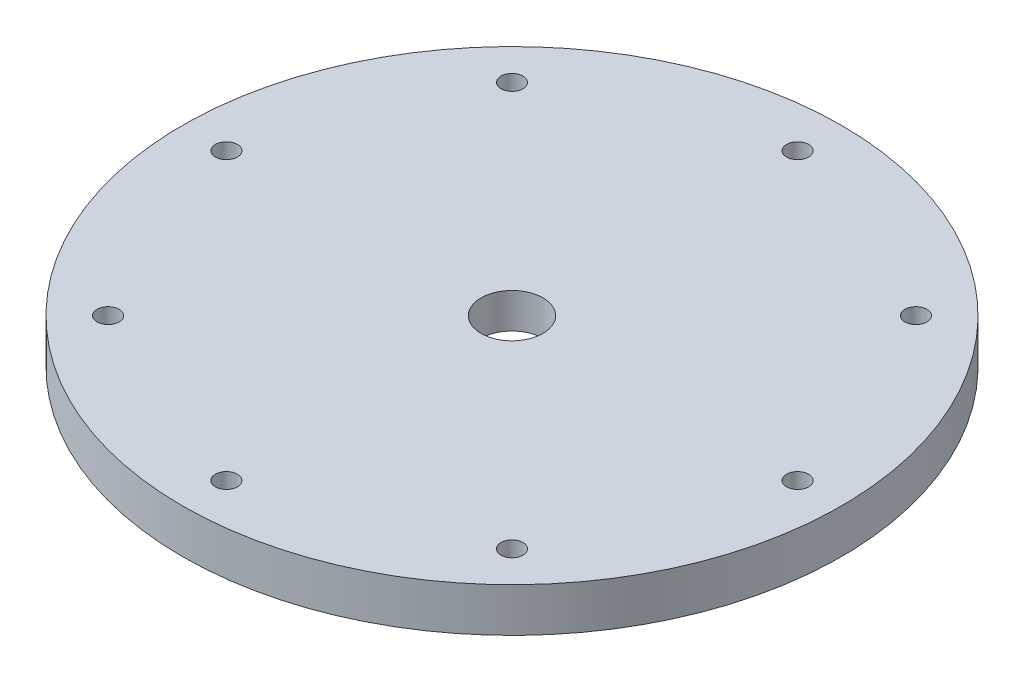
ISO-10303-21;
HEADER;
FILE_DESCRIPTION(('STEP AP214'),'2;1');
FILE_NAME('part.step','',(''),(''),'','','');
FILE_SCHEMA(('AUTOMOTIVE_DESIGN { 1 0 10303 214 1 1 1 1 }'));
ENDSEC;
DATA;
#1=APPLICATION_CONTEXT('core data for automotive mechanical design processes');
#2=APPLICATION_PROTOCOL_DEFINITION('international standard','automotive_design',2000,#1);
#3=PRODUCT_CONTEXT('',#1,'mechanical');
#4=PRODUCT('Part','Part','',(#3));
#5=PRODUCT_RELATED_PRODUCT_CATEGORY('part','',(#4));
#6=PRODUCT_DEFINITION_FORMATION('','',#4);
#7=PRODUCT_DEFINITION_CONTEXT('part definition',#1,'design');
#8=PRODUCT_DEFINITION('design','',#6,#7);
#9=PRODUCT_DEFINITION_SHAPE('','',#8);
#10=(LENGTH_UNIT() NAMED_UNIT(*) SI_UNIT(.MILLI.,.METRE.));
#11=(NAMED_UNIT(*) PLANE_ANGLE_UNIT() SI_UNIT($,.RADIAN.));
#12=(NAMED_UNIT(*) SI_UNIT($,.STERADIAN.) SOLID_ANGLE_UNIT());
#13=UNCERTAINTY_MEASURE_WITH_UNIT(LENGTH_MEASURE(1.E-05),#10,'distance_accuracy_value','');
#14=(GEOMETRIC_REPRESENTATION_CONTEXT(3) GLOBAL_UNCERTAINTY_ASSIGNED_CONTEXT((#13)) GLOBAL_UNIT_ASSIGNED_CONTEXT((#10,
#11,#12)) REPRESENTATION_CONTEXT('',''));
#15=CARTESIAN_POINT('',(0.,0.,0.));
#16=DIRECTION('',(0.,0.,1.));
#17=DIRECTION('',(1.,0.,0.));
#18=AXIS2_PLACEMENT_3D('',#15,#16,#17);
#19=CARTESIAN_POINT('',(0.,12.7,0.));
#20=DIRECTION('',(0.,-1.,0.));
#21=DIRECTION('',(0.,0.,-1.));
#22=AXIS2_PLACEMENT_3D('',#19,#20,#21);
#23=CYLINDRICAL_SURFACE('',#22,95.25);
#24=CARTESIAN_POINT('',(0.,12.7,0.));
#25=DIRECTION('',(0.,1.,0.));
#26=DIRECTION('',(0.,0.,1.));
#27=AXIS2_PLACEMENT_3D('',#24,#25,#26);
#28=CIRCLE('',#27,95.25);
#29=CARTESIAN_POINT('',(0.,12.7,95.25));
#30=VERTEX_POINT('',#29);
#31=EDGE_CURVE('E10',#30,#30,#28,.T.);
#32=ORIENTED_EDGE('',*,*,#31,.F.);
#33=EDGE_LOOP('',(#32));
#34=FACE_BOUND('',#33,.T.);
#35=CARTESIAN_POINT('',(0.,0.,0.));
#36=DIRECTION('',(0.,1.,0.));
#37=DIRECTION('',(0.,0.,1.));
#38=AXIS2_PLACEMENT_3D('',#35,#36,#37);
#39=CIRCLE('',#38,95.25);
#40=CARTESIAN_POINT('',(0.,0.,95.25));
#41=VERTEX_POINT('',#40);
#42=EDGE_CURVE('E42',#41,#41,#39,.T.);
#43=ORIENTED_EDGE('',*,*,#42,.T.);
#44=EDGE_LOOP('',(#43));
#45=FACE_BOUND('',#44,.T.);
#46=ADVANCED_FACE('F39',(#34,#45),#23,.T.);
#47=CARTESIAN_POINT('',(0.,12.7,0.));
#48=DIRECTION('',(0.,1.,0.));
#49=DIRECTION('',(0.,0.,1.));
#50=AXIS2_PLACEMENT_3D('',#47,#48,#49);
#51=PLANE('',#50);
#52=CARTESIAN_POINT('',(0.,12.7,0.));
#53=DIRECTION('',(0.,-1.,0.));
#54=DIRECTION('',(0.,0.,-1.));
#55=AXIS2_PLACEMENT_3D('',#52,#53,#54);
#56=CIRCLE('',#55,8.929751);
#57=CARTESIAN_POINT('',(0.,12.7,-8.929751));
#58=VERTEX_POINT('',#57);
#59=EDGE_CURVE('E137',#58,#58,#56,.T.);
#60=ORIENTED_EDGE('',*,*,#59,.T.);
#61=EDGE_LOOP('',(#60));
#62=FACE_BOUND('',#61,.T.);
#63=CARTESIAN_POINT('',(58.3716647869488,12.7,58.3716647869502));
#64=DIRECTION('',(0.,-1.,0.));
#65=DIRECTION('',(0.,0.,-1.));
#66=AXIS2_PLACEMENT_3D('',#63,#64,#65);
#67=CIRCLE('',#66,3.175);
#68=CARTESIAN_POINT('',(58.3716647869488,12.7,55.1966647869502));
#69=VERTEX_POINT('',#68);
#70=EDGE_CURVE('E108',#69,#69,#67,.T.);
#71=ORIENTED_EDGE('',*,*,#70,.T.);
#72=EDGE_LOOP('',(#71));
#73=FACE_BOUND('',#72,.T.);
#74=CARTESIAN_POINT('',(82.55,12.7,8.64665353564502E-13));
#75=DIRECTION('',(0.,-1.,0.));
#76=DIRECTION('',(0.,0.,-1.));
#77=AXIS2_PLACEMENT_3D('',#74,#75,#76);
#78=CIRCLE('',#77,3.175);
#79=CARTESIAN_POINT('',(82.55,12.7,-3.17499999999913));
#80=VERTEX_POINT('',#79);
#81=EDGE_CURVE('E100',#80,#80,#78,.T.);
#82=ORIENTED_EDGE('',*,*,#81,.T.);
#83=EDGE_LOOP('',(#82));
#84=FACE_BOUND('',#83,.T.);
#85=CARTESIAN_POINT('',(58.37166478695,12.7,-58.371664786949));
#86=DIRECTION('',(0.,-1.,0.));
#87=DIRECTION('',(0.,0.,-1.));
#88=AXIS2_PLACEMENT_3D('',#85,#86,#87);
#89=CIRCLE('',#88,3.175);
#90=CARTESIAN_POINT('',(58.37166478695,12.7,-61.546664786949));
#91=VERTEX_POINT('',#90);
#92=EDGE_CURVE('E92',#91,#91,#89,.T.);
#93=ORIENTED_EDGE('',*,*,#92,.T.);
#94=EDGE_LOOP('',(#93));
#95=FACE_BOUND('',#94,.T.);
#96=CARTESIAN_POINT('',(0.,12.7,-82.55));
#97=DIRECTION('',(0.,-1.,0.));
#98=DIRECTION('',(0.,0.,-1.));
#99=AXIS2_PLACEMENT_3D('',#96,#97,#98);
#100=CIRCLE('',#99,3.175);
#101=CARTESIAN_POINT('',(0.,12.7,-85.725));
#102=VERTEX_POINT('',#101);
#103=EDGE_CURVE('E84',#102,#102,#100,.T.);
#104=ORIENTED_EDGE('',*,*,#103,.T.);
#105=EDGE_LOOP('',(#104));
#106=FACE_BOUND('',#105,.T.);
#107=CARTESIAN_POINT('',(-58.3716647869492,12.7,-58.3716647869498));
#108=DIRECTION('',(0.,-1.,0.));
#109=DIRECTION('',(0.,0.,-1.));
#110=AXIS2_PLACEMENT_3D('',#107,#108,#109);
#111=CIRCLE('',#110,3.175);
#112=CARTESIAN_POINT('',(-58.3716647869492,12.7,-61.5466647869498));
#113=VERTEX_POINT('',#112);
#114=EDGE_CURVE('E76',#113,#113,#111,.T.);
#115=ORIENTED_EDGE('',*,*,#114,.T.);
#116=EDGE_LOOP('',(#115));
#117=FACE_BOUND('',#116,.T.);
#118=CARTESIAN_POINT('',(-82.55,12.7,-2.88221784521501E-13));
#119=DIRECTION('',(0.,-1.,0.));
#120=DIRECTION('',(0.,0.,-1.));
#121=AXIS2_PLACEMENT_3D('',#118,#119,#120);
#122=CIRCLE('',#121,3.175);
#123=CARTESIAN_POINT('',(-82.55,12.7,-3.17500000000029));
#124=VERTEX_POINT('',#123);
#125=EDGE_CURVE('E68',#124,#124,#122,.T.);
#126=ORIENTED_EDGE('',*,*,#125,.T.);
#127=EDGE_LOOP('',(#126));
#128=FACE_BOUND('',#127,.T.);
#129=CARTESIAN_POINT('',(-58.3716647869496,12.7,58.3716647869494));
#130=DIRECTION('',(0.,-1.,0.));
#131=DIRECTION('',(0.,0.,-1.));
#132=AXIS2_PLACEMENT_3D('',#129,#130,#131);
#133=CIRCLE('',#132,3.175);
#134=CARTESIAN_POINT('',(-58.3716647869496,12.7,55.1966647869494));
#135=VERTEX_POINT('',#134);
#136=EDGE_CURVE('E60',#135,#135,#133,.T.);
#137=ORIENTED_EDGE('',*,*,#136,.T.);
#138=EDGE_LOOP('',(#137));
#139=FACE_BOUND('',#138,.T.);
#140=CARTESIAN_POINT('',(0.,12.7,82.55));
#141=DIRECTION('',(0.,-1.,0.));
#142=DIRECTION('',(0.,0.,-1.));
#143=AXIS2_PLACEMENT_3D('',#140,#141,#142);
#144=CIRCLE('',#143,3.175);
#145=CARTESIAN_POINT('',(0.,12.7,79.375));
#146=VERTEX_POINT('',#145);
#147=EDGE_CURVE('E51',#146,#146,#144,.T.);
#148=ORIENTED_EDGE('',*,*,#147,.T.);
#149=EDGE_LOOP('',(#148));
#150=FACE_BOUND('',#149,.T.);
#151=ORIENTED_EDGE('',*,*,#31,.T.);
#152=EDGE_LOOP('',(#151));
#153=FACE_BOUND('',#152,.T.);
#154=ADVANCED_FACE('F171',(#62,#73,#84,#95,#106,#117,#128,#139,#150,#153),#51,.T.);
#155=CARTESIAN_POINT('',(0.,0.,0.));
#156=DIRECTION('',(0.,1.,0.));
#157=DIRECTION('',(0.,0.,1.));
#158=AXIS2_PLACEMENT_3D('',#155,#156,#157);
#159=PLANE('',#158);
#160=CARTESIAN_POINT('',(0.,0.,0.));
#161=DIRECTION('',(0.,-1.,0.));
#162=DIRECTION('',(0.,0.,-1.));
#163=AXIS2_PLACEMENT_3D('',#160,#161,#162);
#164=CIRCLE('',#163,69.9135);
#165=CARTESIAN_POINT('',(0.,0.,-69.9135));
#166=VERTEX_POINT('',#165);
#167=EDGE_CURVE('E117',#166,#166,#164,.T.);
#168=ORIENTED_EDGE('',*,*,#167,.F.);
#169=EDGE_LOOP('',(#168));
#170=FACE_BOUND('',#169,.T.);
#171=CARTESIAN_POINT('',(58.3716647869488,0.,58.3716647869502));
#172=DIRECTION('',(0.,-1.,0.));
#173=DIRECTION('',(0.,0.,-1.));
#174=AXIS2_PLACEMENT_3D('',#171,#172,#173);
#175=CIRCLE('',#174,3.17499999999998);
#176=CARTESIAN_POINT('',(58.3716647869488,0.,55.1966647869502));
#177=VERTEX_POINT('',#176);
#178=EDGE_CURVE('E112',#177,#177,#175,.T.);
#179=ORIENTED_EDGE('',*,*,#178,.F.);
#180=EDGE_LOOP('',(#179));
#181=FACE_BOUND('',#180,.T.);
#182=CARTESIAN_POINT('',(82.55,0.,8.64665353564502E-13));
#183=DIRECTION('',(0.,-1.,0.));
#184=DIRECTION('',(0.,0.,-1.));
#185=AXIS2_PLACEMENT_3D('',#182,#183,#184);
#186=CIRCLE('',#185,3.17499999999998);
#187=CARTESIAN_POINT('',(82.55,0.,-3.17499999999912));
#188=VERTEX_POINT('',#187);
#189=EDGE_CURVE('E104',#188,#188,#186,.T.);
#190=ORIENTED_EDGE('',*,*,#189,.F.);
#191=EDGE_LOOP('',(#190));
#192=FACE_BOUND('',#191,.T.);
#193=CARTESIAN_POINT('',(58.37166478695,0.,-58.371664786949));
#194=DIRECTION('',(0.,-1.,0.));
#195=DIRECTION('',(0.,0.,-1.));
#196=AXIS2_PLACEMENT_3D('',#193,#194,#195);
#197=CIRCLE('',#196,3.17499999999999);
#198=CARTESIAN_POINT('',(58.37166478695,0.,-61.546664786949));
#199=VERTEX_POINT('',#198);
#200=EDGE_CURVE('E96',#199,#199,#197,.T.);
#201=ORIENTED_EDGE('',*,*,#200,.F.);
#202=EDGE_LOOP('',(#201));
#203=FACE_BOUND('',#202,.T.);
#204=CARTESIAN_POINT('',(0.,0.,-82.55));
#205=DIRECTION('',(0.,-1.,0.));
#206=DIRECTION('',(0.,0.,-1.));
#207=AXIS2_PLACEMENT_3D('',#204,#205,#206);
#208=CIRCLE('',#207,3.17499999999999);
#209=CARTESIAN_POINT('',(0.,0.,-85.725));
#210=VERTEX_POINT('',#209);
#211=EDGE_CURVE('E88',#210,#210,#208,.T.);
#212=ORIENTED_EDGE('',*,*,#211,.F.);
#213=EDGE_LOOP('',(#212));
#214=FACE_BOUND('',#213,.T.);
#215=CARTESIAN_POINT('',(-58.3716647869492,0.,-58.3716647869498));
#216=DIRECTION('',(0.,-1.,0.));
#217=DIRECTION('',(0.,0.,-1.));
#218=AXIS2_PLACEMENT_3D('',#215,#216,#217);
#219=CIRCLE('',#218,3.17499999999998);
#220=CARTESIAN_POINT('',(-58.3716647869492,0.,-61.5466647869498));
#221=VERTEX_POINT('',#220);
#222=EDGE_CURVE('E80',#221,#221,#219,.T.);
#223=ORIENTED_EDGE('',*,*,#222,.F.);
#224=EDGE_LOOP('',(#223));
#225=FACE_BOUND('',#224,.T.);
#226=CARTESIAN_POINT('',(-82.55,0.,-2.88221784521501E-13));
#227=DIRECTION('',(0.,-1.,0.));
#228=DIRECTION('',(0.,0.,-1.));
#229=AXIS2_PLACEMENT_3D('',#226,#227,#228);
#230=CIRCLE('',#229,3.17499999999998);
#231=CARTESIAN_POINT('',(-82.55,0.,-3.17500000000027));
#232=VERTEX_POINT('',#231);
#233=EDGE_CURVE('E72',#232,#232,#230,.T.);
#234=ORIENTED_EDGE('',*,*,#233,.F.);
#235=EDGE_LOOP('',(#234));
#236=FACE_BOUND('',#235,.T.);
#237=CARTESIAN_POINT('',(-58.3716647869496,0.,58.3716647869494));
#238=DIRECTION('',(0.,-1.,0.));
#239=DIRECTION('',(0.,0.,-1.));
#240=AXIS2_PLACEMENT_3D('',#237,#238,#239);
#241=CIRCLE('',#240,3.17499999999999);
#242=CARTESIAN_POINT('',(-58.3716647869496,0.,55.1966647869494));
#243=VERTEX_POINT('',#242);
#244=EDGE_CURVE('E64',#243,#243,#241,.T.);
#245=ORIENTED_EDGE('',*,*,#244,.F.);
#246=EDGE_LOOP('',(#245));
#247=FACE_BOUND('',#246,.T.);
#248=CARTESIAN_POINT('',(0.,0.,82.55));
#249=DIRECTION('',(0.,-1.,0.));
#250=DIRECTION('',(0.,0.,-1.));
#251=AXIS2_PLACEMENT_3D('',#248,#249,#250);
#252=CIRCLE('',#251,3.17499999999999);
#253=CARTESIAN_POINT('',(0.,0.,79.375));
#254=VERTEX_POINT('',#253);
#255=EDGE_CURVE('E56',#254,#254,#252,.T.);
#256=ORIENTED_EDGE('',*,*,#255,.F.);
#257=EDGE_LOOP('',(#256));
#258=FACE_BOUND('',#257,.T.);
#259=ORIENTED_EDGE('',*,*,#42,.F.);
#260=EDGE_LOOP('',(#259));
#261=FACE_BOUND('',#260,.T.);
#262=ADVANCED_FACE('F176',(#170,#181,#192,#203,#214,#225,#236,#247,#258,#261),#159,.F.);
#263=CARTESIAN_POINT('',(0.,0.,82.55));
#264=DIRECTION('',(0.,-1.,0.));
#265=DIRECTION('',(0.,0.,-1.));
#266=AXIS2_PLACEMENT_3D('',#263,#264,#265);
#267=CYLINDRICAL_SURFACE('',#266,3.17499999999999);
#268=ORIENTED_EDGE('',*,*,#147,.F.);
#269=EDGE_LOOP('',(#268));
#270=FACE_BOUND('',#269,.T.);
#271=ORIENTED_EDGE('',*,*,#255,.T.);
#272=EDGE_LOOP('',(#271));
#273=FACE_BOUND('',#272,.T.);
#274=ADVANCED_FACE('F183',(#270,#273),#267,.F.);
#275=CARTESIAN_POINT('',(-58.3716647869496,0.,58.3716647869494));
#276=DIRECTION('',(0.,-1.,0.));
#277=DIRECTION('',(0.,0.,-1.));
#278=AXIS2_PLACEMENT_3D('',#275,#276,#277);
#279=CYLINDRICAL_SURFACE('',#278,3.17499999999999);
#280=ORIENTED_EDGE('',*,*,#136,.F.);
#281=EDGE_LOOP('',(#280));
#282=FACE_BOUND('',#281,.T.);
#283=ORIENTED_EDGE('',*,*,#244,.T.);
#284=EDGE_LOOP('',(#283));
#285=FACE_BOUND('',#284,.T.);
#286=ADVANCED_FACE('F188',(#282,#285),#279,.F.);
#287=CARTESIAN_POINT('',(-82.55,0.,-2.88221784521501E-13));
#288=DIRECTION('',(0.,-1.,0.));
#289=DIRECTION('',(0.,0.,-1.));
#290=AXIS2_PLACEMENT_3D('',#287,#288,#289);
#291=CYLINDRICAL_SURFACE('',#290,3.17499999999999);
#292=ORIENTED_EDGE('',*,*,#125,.F.);
#293=EDGE_LOOP('',(#292));
#294=FACE_BOUND('',#293,.T.);
#295=ORIENTED_EDGE('',*,*,#233,.T.);
#296=EDGE_LOOP('',(#295));
#297=FACE_BOUND('',#296,.T.);
#298=ADVANCED_FACE('F196',(#294,#297),#291,.F.);
#299=CARTESIAN_POINT('',(-58.3716647869492,0.,-58.3716647869498));
#300=DIRECTION('',(0.,-1.,0.));
#301=DIRECTION('',(0.,0.,-1.));
#302=AXIS2_PLACEMENT_3D('',#299,#300,#301);
#303=CYLINDRICAL_SURFACE('',#302,3.17499999999999);
#304=ORIENTED_EDGE('',*,*,#114,.F.);
#305=EDGE_LOOP('',(#304));
#306=FACE_BOUND('',#305,.T.);
#307=ORIENTED_EDGE('',*,*,#222,.T.);
#308=EDGE_LOOP('',(#307));
#309=FACE_BOUND('',#308,.T.);
#310=ADVANCED_FACE('F200',(#306,#309),#303,.F.);
#311=CARTESIAN_POINT('',(0.,0.,-82.55));
#312=DIRECTION('',(0.,-1.,0.));
#313=DIRECTION('',(0.,0.,-1.));
#314=AXIS2_PLACEMENT_3D('',#311,#312,#313);
#315=CYLINDRICAL_SURFACE('',#314,3.17499999999999);
#316=ORIENTED_EDGE('',*,*,#103,.F.);
#317=EDGE_LOOP('',(#316));
#318=FACE_BOUND('',#317,.T.);
#319=ORIENTED_EDGE('',*,*,#211,.T.);
#320=EDGE_LOOP('',(#319));
#321=FACE_BOUND('',#320,.T.);
#322=ADVANCED_FACE('F204',(#318,#321),#315,.F.);
#323=CARTESIAN_POINT('',(58.37166478695,0.,-58.371664786949));
#324=DIRECTION('',(0.,-1.,0.));
#325=DIRECTION('',(0.,0.,-1.));
#326=AXIS2_PLACEMENT_3D('',#323,#324,#325);
#327=CYLINDRICAL_SURFACE('',#326,3.17499999999999);
#328=ORIENTED_EDGE('',*,*,#92,.F.);
#329=EDGE_LOOP('',(#328));
#330=FACE_BOUND('',#329,.T.);
#331=ORIENTED_EDGE('',*,*,#200,.T.);
#332=EDGE_LOOP('',(#331));
#333=FACE_BOUND('',#332,.T.);
#334=ADVANCED_FACE('F208',(#330,#333),#327,.F.);
#335=CARTESIAN_POINT('',(82.55,0.,8.64665353564502E-13));
#336=DIRECTION('',(0.,-1.,0.));
#337=DIRECTION('',(0.,0.,-1.));
#338=AXIS2_PLACEMENT_3D('',#335,#336,#337);
#339=CYLINDRICAL_SURFACE('',#338,3.17499999999999);
#340=ORIENTED_EDGE('',*,*,#81,.F.);
#341=EDGE_LOOP('',(#340));
#342=FACE_BOUND('',#341,.T.);
#343=ORIENTED_EDGE('',*,*,#189,.T.);
#344=EDGE_LOOP('',(#343));
#345=FACE_BOUND('',#344,.T.);
#346=ADVANCED_FACE('F212',(#342,#345),#339,.F.);
#347=CARTESIAN_POINT('',(58.3716647869488,0.,58.3716647869502));
#348=DIRECTION('',(0.,-1.,0.));
#349=DIRECTION('',(0.,0.,-1.));
#350=AXIS2_PLACEMENT_3D('',#347,#348,#349);
#351=CYLINDRICAL_SURFACE('',#350,3.17499999999999);
#352=ORIENTED_EDGE('',*,*,#70,.F.);
#353=EDGE_LOOP('',(#352));
#354=FACE_BOUND('',#353,.T.);
#355=ORIENTED_EDGE('',*,*,#178,.T.);
#356=EDGE_LOOP('',(#355));
#357=FACE_BOUND('',#356,.T.);
#358=ADVANCED_FACE('F216',(#354,#357),#351,.F.);
#359=CARTESIAN_POINT('',(0.,2.54,0.));
#360=DIRECTION('',(0.,-1.,0.));
#361=DIRECTION('',(0.,0.,-1.));
#362=AXIS2_PLACEMENT_3D('',#359,#360,#361);
#363=CYLINDRICAL_SURFACE('',#362,69.9135);
#364=CARTESIAN_POINT('',(0.,2.54,0.));
#365=DIRECTION('',(0.,-1.,0.));
#366=DIRECTION('',(0.,0.,-1.));
#367=AXIS2_PLACEMENT_3D('',#364,#365,#366);
#368=CIRCLE('',#367,69.9135);
#369=CARTESIAN_POINT('',(0.,2.54,-69.9135));
#370=VERTEX_POINT('',#369);
#371=EDGE_CURVE('E116',#370,#370,#368,.T.);
#372=ORIENTED_EDGE('',*,*,#371,.F.);
#373=EDGE_LOOP('',(#372));
#374=FACE_BOUND('',#373,.T.);
#375=ORIENTED_EDGE('',*,*,#167,.T.);
#376=EDGE_LOOP('',(#375));
#377=FACE_BOUND('',#376,.T.);
#378=ADVANCED_FACE('F220',(#374,#377),#363,.F.);
#379=CARTESIAN_POINT('',(0.,2.54,0.));
#380=DIRECTION('',(0.,-1.,0.));
#381=DIRECTION('',(0.,0.,-1.));
#382=AXIS2_PLACEMENT_3D('',#379,#380,#381);
#383=PLANE('',#382);
#384=CARTESIAN_POINT('',(0.,2.54,0.));
#385=DIRECTION('',(0.,-1.,0.));
#386=DIRECTION('',(0.,0.,-1.));
#387=AXIS2_PLACEMENT_3D('',#384,#385,#386);
#388=CIRCLE('',#387,68.3133);
#389=CARTESIAN_POINT('',(0.,2.54,-68.3133));
#390=VERTEX_POINT('',#389);
#391=EDGE_CURVE('E125',#390,#390,#388,.T.);
#392=ORIENTED_EDGE('',*,*,#391,.F.);
#393=EDGE_LOOP('',(#392));
#394=FACE_BOUND('',#393,.T.);
#395=ORIENTED_EDGE('',*,*,#371,.T.);
#396=EDGE_LOOP('',(#395));
#397=FACE_BOUND('',#396,.T.);
#398=ADVANCED_FACE('F156',(#394,#397),#383,.T.);
#399=CARTESIAN_POINT('',(0.,3.8608,0.));
#400=DIRECTION('',(0.,-1.,0.));
#401=DIRECTION('',(0.,0.,-1.));
#402=AXIS2_PLACEMENT_3D('',#399,#400,#401);
#403=CYLINDRICAL_SURFACE('',#402,68.3133);
#404=CARTESIAN_POINT('',(0.,3.8608,0.));
#405=DIRECTION('',(0.,-1.,0.));
#406=DIRECTION('',(0.,0.,-1.));
#407=AXIS2_PLACEMENT_3D('',#404,#405,#406);
#408=CIRCLE('',#407,68.3133);
#409=CARTESIAN_POINT('',(0.,3.8608,-68.3133));
#410=VERTEX_POINT('',#409);
#411=EDGE_CURVE('E121',#410,#410,#408,.T.);
#412=ORIENTED_EDGE('',*,*,#411,.F.);
#413=EDGE_LOOP('',(#412));
#414=FACE_BOUND('',#413,.T.);
#415=ORIENTED_EDGE('',*,*,#391,.T.);
#416=EDGE_LOOP('',(#415));
#417=FACE_BOUND('',#416,.T.);
#418=ADVANCED_FACE('F166',(#414,#417),#403,.F.);
#419=CARTESIAN_POINT('',(0.,3.8608,0.));
#420=DIRECTION('',(0.,-1.,0.));
#421=DIRECTION('',(0.,0.,-1.));
#422=AXIS2_PLACEMENT_3D('',#419,#420,#421);
#423=PLANE('',#422);
#424=CARTESIAN_POINT('',(0.,3.8608,0.));
#425=DIRECTION('',(0.,-1.,0.));
#426=DIRECTION('',(0.,0.,-1.));
#427=AXIS2_PLACEMENT_3D('',#424,#425,#426);
#428=CIRCLE('',#427,66.1289);
#429=CARTESIAN_POINT('',(0.,3.8608,-66.1289));
#430=VERTEX_POINT('',#429);
#431=EDGE_CURVE('E129',#430,#430,#428,.T.);
#432=ORIENTED_EDGE('',*,*,#431,.F.);
#433=EDGE_LOOP('',(#432));
#434=FACE_BOUND('',#433,.T.);
#435=ORIENTED_EDGE('',*,*,#411,.T.);
#436=EDGE_LOOP('',(#435));
#437=FACE_BOUND('',#436,.T.);
#438=ADVANCED_FACE('F160',(#434,#437),#423,.T.);
#439=CARTESIAN_POINT('',(0.,3.8608,0.));
#440=DIRECTION('',(0.,-1.,0.));
#441=DIRECTION('',(0.,0.,-1.));
#442=AXIS2_PLACEMENT_3D('',#439,#440,#441);
#443=CYLINDRICAL_SURFACE('',#442,66.1289);
#444=ORIENTED_EDGE('',*,*,#431,.T.);
#445=EDGE_LOOP('',(#444));
#446=FACE_BOUND('',#445,.T.);
#447=CARTESIAN_POINT('',(0.,2.54,0.));
#448=DIRECTION('',(0.,-1.,0.));
#449=DIRECTION('',(0.,0.,-1.));
#450=AXIS2_PLACEMENT_3D('',#447,#448,#449);
#451=CIRCLE('',#450,66.1289);
#452=CARTESIAN_POINT('',(0.,2.54,-66.1289));
#453=VERTEX_POINT('',#452);
#454=EDGE_CURVE('E133',#453,#453,#451,.T.);
#455=ORIENTED_EDGE('',*,*,#454,.F.);
#456=EDGE_LOOP('',(#455));
#457=FACE_BOUND('',#456,.T.);
#458=ADVANCED_FACE('F154',(#446,#457),#443,.T.);
#459=CARTESIAN_POINT('',(0.,2.54,0.));
#460=DIRECTION('',(0.,-1.,0.));
#461=DIRECTION('',(0.,0.,-1.));
#462=AXIS2_PLACEMENT_3D('',#459,#460,#461);
#463=CIRCLE('',#462,8.929751);
#464=CARTESIAN_POINT('',(0.,2.54,-8.929751));
#465=VERTEX_POINT('',#464);
#466=EDGE_CURVE('E144',#465,#465,#463,.T.);
#467=ORIENTED_EDGE('',*,*,#466,.F.);
#468=EDGE_LOOP('',(#467));
#469=FACE_BOUND('',#468,.T.);
#470=ORIENTED_EDGE('',*,*,#454,.T.);
#471=EDGE_LOOP('',(#470));
#472=FACE_BOUND('',#471,.T.);
#473=ADVANCED_FACE('F151',(#469,#472),#383,.T.);
#474=CARTESIAN_POINT('',(0.,2.54,0.));
#475=DIRECTION('',(0.,-1.,0.));
#476=DIRECTION('',(0.,0.,-1.));
#477=AXIS2_PLACEMENT_3D('',#474,#475,#476);
#478=CYLINDRICAL_SURFACE('',#477,8.929751);
#479=ORIENTED_EDGE('',*,*,#59,.F.);
#480=EDGE_LOOP('',(#479));
#481=FACE_BOUND('',#480,.T.);
#482=ORIENTED_EDGE('',*,*,#466,.T.);
#483=EDGE_LOOP('',(#482));
#484=FACE_BOUND('',#483,.T.);
#485=ADVANCED_FACE('F149',(#481,#484),#478,.F.);
#486=CLOSED_SHELL('',(#46,#154,#262,#274,#286,#298,#310,#322,#334,#346,#358,#378,#398,#418,#438,
#458,#473,#485));
#487=MANIFOLD_SOLID_BREP('B2',#486);
#488=ADVANCED_BREP_SHAPE_REPRESENTATION('',(#18,#487),#14);
#489=SHAPE_DEFINITION_REPRESENTATION(#9,#488);
ENDSEC;
END-ISO-10303-21;
